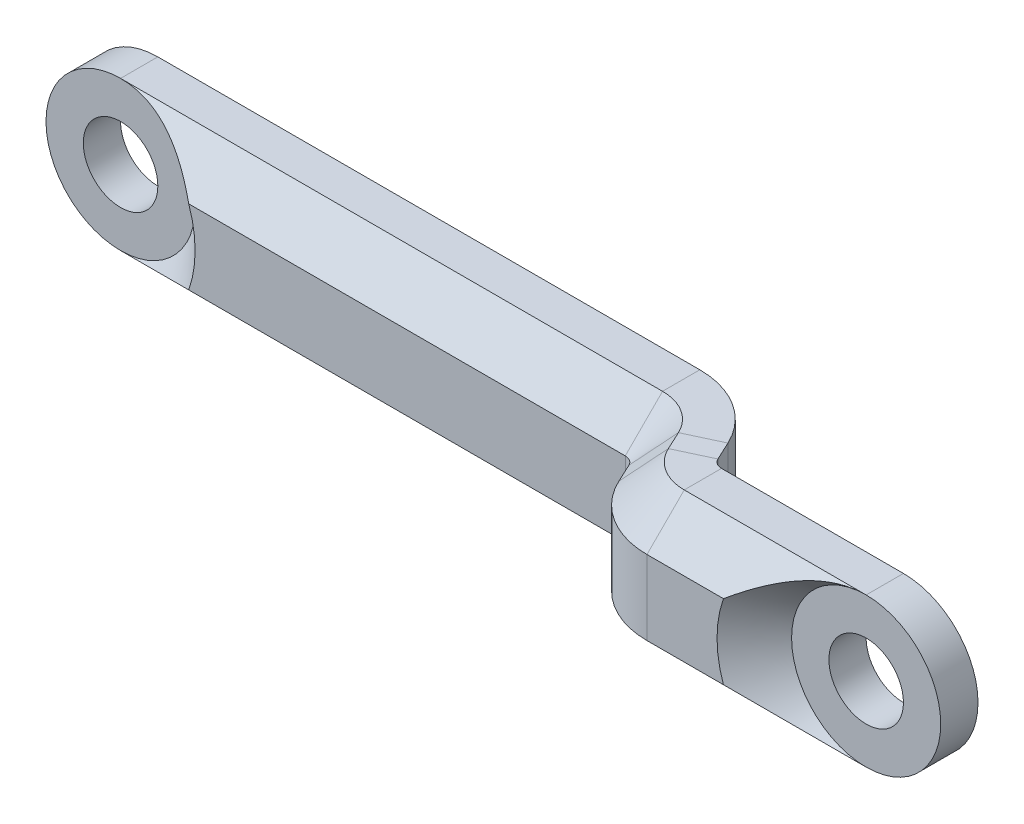
ISO-10303-21;
HEADER;
FILE_DESCRIPTION(('STEP AP214'),'2;1');
FILE_NAME('part.step','',(''),(''),'','','');
FILE_SCHEMA(('AUTOMOTIVE_DESIGN { 1 0 10303 214 1 1 1 1 }'));
ENDSEC;
DATA;
#1=APPLICATION_CONTEXT('core data for automotive mechanical design processes');
#2=APPLICATION_PROTOCOL_DEFINITION('international standard','automotive_design',2000,#1);
#3=PRODUCT_CONTEXT('',#1,'mechanical');
#4=PRODUCT('Part','Part','',(#3));
#5=PRODUCT_RELATED_PRODUCT_CATEGORY('part','',(#4));
#6=PRODUCT_DEFINITION_FORMATION('','',#4);
#7=PRODUCT_DEFINITION_CONTEXT('part definition',#1,'design');
#8=PRODUCT_DEFINITION('design','',#6,#7);
#9=PRODUCT_DEFINITION_SHAPE('','',#8);
#10=(LENGTH_UNIT() NAMED_UNIT(*) SI_UNIT(.MILLI.,.METRE.));
#11=(NAMED_UNIT(*) PLANE_ANGLE_UNIT() SI_UNIT($,.RADIAN.));
#12=(NAMED_UNIT(*) SI_UNIT($,.STERADIAN.) SOLID_ANGLE_UNIT());
#13=UNCERTAINTY_MEASURE_WITH_UNIT(LENGTH_MEASURE(1.E-05),#10,'distance_accuracy_value','');
#14=(GEOMETRIC_REPRESENTATION_CONTEXT(3) GLOBAL_UNCERTAINTY_ASSIGNED_CONTEXT((#13)) GLOBAL_UNIT_ASSIGNED_CONTEXT((#10,
#11,#12)) REPRESENTATION_CONTEXT('',''));
#15=CARTESIAN_POINT('',(0.,0.,0.));
#16=DIRECTION('',(0.,0.,1.));
#17=DIRECTION('',(1.,0.,0.));
#18=AXIS2_PLACEMENT_3D('',#15,#16,#17);
#19=CARTESIAN_POINT('',(0.,0.,-5.));
#20=DIRECTION('',(0.,0.,1.));
#21=DIRECTION('',(1.,0.,0.));
#22=AXIS2_PLACEMENT_3D('',#19,#20,#21);
#23=CYLINDRICAL_SURFACE('',#22,2.5);
#24=CARTESIAN_POINT('',(0.,0.,-5.));
#25=DIRECTION('',(0.,0.,1.));
#26=DIRECTION('',(1.,0.,0.));
#27=AXIS2_PLACEMENT_3D('',#24,#25,#26);
#28=CIRCLE('',#27,2.5);
#29=CARTESIAN_POINT('',(2.5,0.,-5.));
#30=VERTEX_POINT('',#29);
#31=EDGE_CURVE('E435',#30,#30,#28,.T.);
#32=ORIENTED_EDGE('',*,*,#31,.F.);
#33=EDGE_LOOP('',(#32));
#34=FACE_BOUND('',#33,.T.);
#35=CARTESIAN_POINT('',(0.,0.,-2.5));
#36=DIRECTION('',(0.,0.,1.));
#37=DIRECTION('',(1.,0.,0.));
#38=AXIS2_PLACEMENT_3D('',#35,#36,#37);
#39=CIRCLE('',#38,2.5);
#40=CARTESIAN_POINT('',(2.5,0.,-2.5));
#41=VERTEX_POINT('',#40);
#42=EDGE_CURVE('E196',#41,#41,#39,.F.);
#43=ORIENTED_EDGE('',*,*,#42,.F.);
#44=EDGE_LOOP('',(#43));
#45=FACE_BOUND('',#44,.T.);
#46=ADVANCED_FACE('F45',(#34,#45),#23,.F.);
#47=CARTESIAN_POINT('',(0.,0.,-5.));
#48=DIRECTION('',(0.,0.,1.));
#49=DIRECTION('',(1.,0.,0.));
#50=AXIS2_PLACEMENT_3D('',#47,#48,#49);
#51=CYLINDRICAL_SURFACE('',#50,5.);
#52=DIRECTION('',(0.,0.,1.));
#53=VECTOR('',#52,1.);
#54=CARTESIAN_POINT('',(0.,-5.,-5.));
#55=LINE('',#54,#53);
#56=CARTESIAN_POINT('',(0.,-5.,-5.));
#57=VERTEX_POINT('',#56);
#58=CARTESIAN_POINT('',(0.,-5.,-2.5));
#59=VERTEX_POINT('',#58);
#60=EDGE_CURVE('E195',#57,#59,#55,.T.);
#61=ORIENTED_EDGE('',*,*,#60,.T.);
#62=CARTESIAN_POINT('',(0.,0.,-2.5));
#63=DIRECTION('',(0.,0.,1.));
#64=DIRECTION('',(1.,0.,0.));
#65=AXIS2_PLACEMENT_3D('',#62,#63,#64);
#66=CIRCLE('',#65,5.);
#67=CARTESIAN_POINT('',(0.,5.,-2.5));
#68=VERTEX_POINT('',#67);
#69=EDGE_CURVE('E182',#68,#59,#66,.T.);
#70=ORIENTED_EDGE('',*,*,#69,.F.);
#71=DIRECTION('',(0.,0.,1.));
#72=VECTOR('',#71,1.);
#73=CARTESIAN_POINT('',(0.,5.,-5.));
#74=LINE('',#73,#72);
#75=CARTESIAN_POINT('',(0.,5.,-5.));
#76=VERTEX_POINT('',#75);
#77=EDGE_CURVE('E193',#76,#68,#74,.T.);
#78=ORIENTED_EDGE('',*,*,#77,.F.);
#79=CARTESIAN_POINT('',(0.,0.,-5.));
#80=DIRECTION('',(0.,0.,1.));
#81=DIRECTION('',(1.,0.,0.));
#82=AXIS2_PLACEMENT_3D('',#79,#80,#81);
#83=CIRCLE('',#82,5.);
#84=EDGE_CURVE('E442',#76,#57,#83,.T.);
#85=ORIENTED_EDGE('',*,*,#84,.T.);
#86=EDGE_LOOP('',(#61,#70,#78,#85));
#87=FACE_BOUND('',#86,.T.);
#88=ADVANCED_FACE('F191',(#87),#51,.T.);
#89=CARTESIAN_POINT('',(55.,0.,0.));
#90=DIRECTION('',(0.,0.,1.));
#91=DIRECTION('',(1.,0.,0.));
#92=AXIS2_PLACEMENT_3D('',#89,#90,#91);
#93=CYLINDRICAL_SURFACE('',#92,5.);
#94=DIRECTION('',(0.,0.,1.));
#95=VECTOR('',#94,1.);
#96=CARTESIAN_POINT('',(55.,5.,0.));
#97=LINE('',#96,#95);
#98=CARTESIAN_POINT('',(55.,5.,0.));
#99=VERTEX_POINT('',#98);
#100=CARTESIAN_POINT('',(55.,5.,2.50000000000002));
#101=VERTEX_POINT('',#100);
#102=EDGE_CURVE('E513',#99,#101,#97,.T.);
#103=ORIENTED_EDGE('',*,*,#102,.T.);
#104=CARTESIAN_POINT('',(55.,0.,2.50000000000002));
#105=DIRECTION('',(0.,0.,1.));
#106=DIRECTION('',(1.,0.,0.));
#107=AXIS2_PLACEMENT_3D('',#104,#105,#106);
#108=CIRCLE('',#107,5.);
#109=CARTESIAN_POINT('',(55.,-5.,2.50000000000002));
#110=VERTEX_POINT('',#109);
#111=EDGE_CURVE('E563',#110,#101,#108,.T.);
#112=ORIENTED_EDGE('',*,*,#111,.F.);
#113=DIRECTION('',(0.,0.,1.));
#114=VECTOR('',#113,1.);
#115=CARTESIAN_POINT('',(55.,-5.,0.));
#116=LINE('',#115,#114);
#117=CARTESIAN_POINT('',(55.,-5.,0.));
#118=VERTEX_POINT('',#117);
#119=EDGE_CURVE('E526',#118,#110,#116,.T.);
#120=ORIENTED_EDGE('',*,*,#119,.F.);
#121=CARTESIAN_POINT('',(55.,0.,0.));
#122=DIRECTION('',(0.,0.,1.));
#123=DIRECTION('',(1.,0.,0.));
#124=AXIS2_PLACEMENT_3D('',#121,#122,#123);
#125=CIRCLE('',#124,5.);
#126=EDGE_CURVE('E510',#118,#99,#125,.T.);
#127=ORIENTED_EDGE('',*,*,#126,.T.);
#128=EDGE_LOOP('',(#103,#112,#120,#127));
#129=FACE_BOUND('',#128,.T.);
#130=ADVANCED_FACE('F249',(#129),#93,.T.);
#131=CARTESIAN_POINT('',(55.,0.,0.));
#132=DIRECTION('',(0.,0.,1.));
#133=DIRECTION('',(1.,0.,0.));
#134=AXIS2_PLACEMENT_3D('',#131,#132,#133);
#135=CYLINDRICAL_SURFACE('',#134,2.49999999999999);
#136=CARTESIAN_POINT('',(55.,0.,0.));
#137=DIRECTION('',(0.,0.,1.));
#138=DIRECTION('',(1.,0.,0.));
#139=AXIS2_PLACEMENT_3D('',#136,#137,#138);
#140=CIRCLE('',#139,2.49999999999999);
#141=CARTESIAN_POINT('',(57.5,0.,0.));
#142=VERTEX_POINT('',#141);
#143=EDGE_CURVE('E551',#142,#142,#140,.T.);
#144=ORIENTED_EDGE('',*,*,#143,.F.);
#145=EDGE_LOOP('',(#144));
#146=FACE_BOUND('',#145,.T.);
#147=CARTESIAN_POINT('',(55.,0.,2.50000000000002));
#148=DIRECTION('',(0.,0.,1.));
#149=DIRECTION('',(1.,0.,0.));
#150=AXIS2_PLACEMENT_3D('',#147,#148,#149);
#151=CIRCLE('',#150,2.49999999999999);
#152=CARTESIAN_POINT('',(57.5,0.,2.50000000000002));
#153=VERTEX_POINT('',#152);
#154=EDGE_CURVE('E521',#153,#153,#151,.F.);
#155=ORIENTED_EDGE('',*,*,#154,.F.);
#156=EDGE_LOOP('',(#155));
#157=FACE_BOUND('',#156,.T.);
#158=ADVANCED_FACE('F280',(#146,#157),#135,.F.);
#159=CARTESIAN_POINT('',(24.6325131511786,5.,-37.9556818981374));
#160=DIRECTION('',(0.,1.,0.));
#161=DIRECTION('',(-0.906307787036651,0.,0.422618261740697));
#162=AXIS2_PLACEMENT_3D('',#159,#160,#161);
#163=PLANE('',#162);
#164=DIRECTION('',(0.906307787036651,0.,-0.422618261740697));
#165=VECTOR('',#164,1.);
#166=CARTESIAN_POINT('',(41.5445079929662,5.,-1.68779192030168));
#167=LINE('',#166,#165);
#168=CARTESIAN_POINT('',(39.2787385253746,5.,-0.631246265949928));
#169=VERTEX_POINT('',#168);
#170=CARTESIAN_POINT('',(41.5445079929662,5.,-1.68779192030168));
#171=VERTEX_POINT('',#170);
#172=EDGE_CURVE('E455',#169,#171,#167,.T.);
#173=ORIENTED_EDGE('',*,*,#172,.F.);
#174=DIRECTION('',(0.422618261740697,0.,0.906307787036651));
#175=VECTOR('',#174,1.);
#176=CARTESIAN_POINT('',(22.366743683587,5.,-36.8991362437856));
#177=LINE('',#176,#175);
#178=CARTESIAN_POINT('',(39.867448461363,5.,0.631246265949968));
#179=VERTEX_POINT('',#178);
#180=EDGE_CURVE('E368',#169,#179,#177,.T.);
#181=ORIENTED_EDGE('',*,*,#180,.T.);
#182=DIRECTION('',(0.906307787036651,0.,-0.422618261740697));
#183=VECTOR('',#182,1.);
#184=CARTESIAN_POINT('',(42.1332179289546,5.,-0.425299388401787));
#185=LINE('',#184,#183);
#186=CARTESIAN_POINT('',(42.1332179289546,5.,-0.425299388401786));
#187=VERTEX_POINT('',#186);
#188=EDGE_CURVE('E460',#179,#187,#185,.T.);
#189=ORIENTED_EDGE('',*,*,#188,.T.);
#190=DIRECTION('',(-0.422618261740697,0.,-0.906307787036651));
#191=VECTOR('',#190,1.);
#192=CARTESIAN_POINT('',(24.6325131511786,5.,-37.9556818981374));
#193=LINE('',#192,#191);
#194=EDGE_CURVE('E451',#187,#171,#193,.T.);
#195=ORIENTED_EDGE('',*,*,#194,.T.);
#196=EDGE_LOOP('',(#173,#181,#189,#195));
#197=FACE_BOUND('',#196,.T.);
#198=ADVANCED_FACE('F276',(#197),#163,.T.);
#199=CARTESIAN_POINT('',(24.6325131511786,-5.,-37.9556818981374));
#200=DIRECTION('',(0.,-1.,0.));
#201=DIRECTION('',(0.906307787036651,0.,-0.422618261740697));
#202=AXIS2_PLACEMENT_3D('',#199,#200,#201);
#203=PLANE('',#202);
#204=DIRECTION('',(-0.906307787036651,0.,0.422618261740697));
#205=VECTOR('',#204,1.);
#206=CARTESIAN_POINT('',(42.1332179289546,-5.,-0.425299388401787));
#207=LINE('',#206,#205);
#208=CARTESIAN_POINT('',(42.1332179289546,-5.,-0.425299388401786));
#209=VERTEX_POINT('',#208);
#210=CARTESIAN_POINT('',(39.867448461363,-5.,0.631246265949968));
#211=VERTEX_POINT('',#210);
#212=EDGE_CURVE('E465',#209,#211,#207,.T.);
#213=ORIENTED_EDGE('',*,*,#212,.T.);
#214=DIRECTION('',(-0.422618261740697,0.,-0.906307787036651));
#215=VECTOR('',#214,1.);
#216=CARTESIAN_POINT('',(22.366743683587,-5.,-36.8991362437856));
#217=LINE('',#216,#215);
#218=CARTESIAN_POINT('',(39.2787385253746,-5.,-0.631246265949931));
#219=VERTEX_POINT('',#218);
#220=EDGE_CURVE('E395',#211,#219,#217,.T.);
#221=ORIENTED_EDGE('',*,*,#220,.T.);
#222=DIRECTION('',(-0.906307787036651,0.,0.422618261740697));
#223=VECTOR('',#222,1.);
#224=CARTESIAN_POINT('',(41.5445079929662,-5.,-1.68779192030168));
#225=LINE('',#224,#223);
#226=CARTESIAN_POINT('',(41.5445079929662,-4.99999999999999,-1.68779192030168));
#227=VERTEX_POINT('',#226);
#228=EDGE_CURVE('E430',#227,#219,#225,.T.);
#229=ORIENTED_EDGE('',*,*,#228,.F.);
#230=DIRECTION('',(0.422618261740697,0.,0.906307787036651));
#231=VECTOR('',#230,1.);
#232=CARTESIAN_POINT('',(24.6325131511786,-5.,-37.9556818981374));
#233=LINE('',#232,#231);
#234=EDGE_CURVE('E203',#227,#209,#233,.T.);
#235=ORIENTED_EDGE('',*,*,#234,.T.);
#236=EDGE_LOOP('',(#213,#221,#229,#235));
#237=FACE_BOUND('',#236,.T.);
#238=ADVANCED_FACE('F279',(#237),#203,.T.);
#239=CARTESIAN_POINT('',(20.1009742159954,0.,-35.8425905894339));
#240=DIRECTION('',(-0.906307787036651,0.,0.422618261740697));
#241=DIRECTION('',(0.422618261740697,0.,0.906307787036651));
#242=AXIS2_PLACEMENT_3D('',#239,#240,#241);
#243=PLANE('',#242);
#244=DIRECTION('',(0.,1.,0.));
#245=VECTOR('',#244,1.);
#246=CARTESIAN_POINT('',(37.6016789937714,0.,1.6877919203017));
#247=LINE('',#246,#245);
#248=CARTESIAN_POINT('',(37.6016789937714,-2.50000000000002,1.6877919203017));
#249=VERTEX_POINT('',#248);
#250=CARTESIAN_POINT('',(37.6016789937714,2.50000000000001,1.6877919203017));
#251=VERTEX_POINT('',#250);
#252=EDGE_CURVE('E462',#249,#251,#247,.T.);
#253=ORIENTED_EDGE('',*,*,#252,.T.);
#254=DIRECTION('',(-0.422618261740697,0.,-0.906307787036651));
#255=VECTOR('',#254,1.);
#256=CARTESIAN_POINT('',(20.1009742159954,2.50000000000001,-35.8425905894339));
#257=LINE('',#256,#255);
#258=CARTESIAN_POINT('',(37.012969057783,2.50000000000002,0.425299388401801));
#259=VERTEX_POINT('',#258);
#260=EDGE_CURVE('E366',#251,#259,#257,.T.);
#261=ORIENTED_EDGE('',*,*,#260,.T.);
#262=DIRECTION('',(0.,1.,0.));
#263=VECTOR('',#262,1.);
#264=CARTESIAN_POINT('',(37.012969057783,0.,0.425299388401801));
#265=LINE('',#264,#263);
#266=CARTESIAN_POINT('',(37.012969057783,-2.50000000000001,0.425299388401801));
#267=VERTEX_POINT('',#266);
#268=EDGE_CURVE('E453',#267,#259,#265,.T.);
#269=ORIENTED_EDGE('',*,*,#268,.F.);
#270=DIRECTION('',(0.422618261740697,0.,0.906307787036651));
#271=VECTOR('',#270,1.);
#272=CARTESIAN_POINT('',(20.1009742159954,-2.50000000000002,-35.8425905894339));
#273=LINE('',#272,#271);
#274=EDGE_CURVE('E394',#267,#249,#273,.T.);
#275=ORIENTED_EDGE('',*,*,#274,.T.);
#276=EDGE_LOOP('',(#253,#261,#269,#275));
#277=FACE_BOUND('',#276,.T.);
#278=ADVANCED_FACE('F274',(#277),#243,.T.);
#279=CARTESIAN_POINT('',(24.6325131511786,0.,-37.9556818981374));
#280=DIRECTION('',(-0.906307787036651,0.,0.422618261740697));
#281=DIRECTION('',(0.422618261740697,0.,0.906307787036651));
#282=AXIS2_PLACEMENT_3D('',#279,#280,#281);
#283=PLANE('',#282);
#284=DIRECTION('',(0.,1.,0.));
#285=VECTOR('',#284,1.);
#286=CARTESIAN_POINT('',(42.1332179289546,0.,-0.425299388401787));
#287=LINE('',#286,#285);
#288=EDGE_CURVE('E457',#209,#187,#287,.T.);
#289=ORIENTED_EDGE('',*,*,#288,.F.);
#290=ORIENTED_EDGE('',*,*,#234,.F.);
#291=DIRECTION('',(0.,1.,0.));
#292=VECTOR('',#291,1.);
#293=CARTESIAN_POINT('',(41.5445079929662,0.,-1.68779192030168));
#294=LINE('',#293,#292);
#295=EDGE_CURVE('E448',#227,#171,#294,.T.);
#296=ORIENTED_EDGE('',*,*,#295,.T.);
#297=ORIENTED_EDGE('',*,*,#194,.F.);
#298=EDGE_LOOP('',(#289,#290,#296,#297));
#299=FACE_BOUND('',#298,.T.);
#300=ADVANCED_FACE('F261',(#299),#283,.F.);
#301=CARTESIAN_POINT('',(0.,0.,-5.));
#302=DIRECTION('',(0.,0.,1.));
#303=DIRECTION('',(1.,0.,0.));
#304=AXIS2_PLACEMENT_3D('',#301,#302,#303);
#305=PLANE('',#304);
#306=DIRECTION('',(0.,1.,0.));
#307=VECTOR('',#306,1.);
#308=CARTESIAN_POINT('',(36.3453827418518,0.,-5.));
#309=LINE('',#308,#307);
#310=CARTESIAN_POINT('',(36.3453827418518,-4.99999999999999,-5.));
#311=VERTEX_POINT('',#310);
#312=CARTESIAN_POINT('',(36.3453827418518,5.,-5.));
#313=VERTEX_POINT('',#312);
#314=EDGE_CURVE('E444',#311,#313,#309,.T.);
#315=ORIENTED_EDGE('',*,*,#314,.F.);
#316=DIRECTION('',(1.,0.,0.));
#317=VECTOR('',#316,1.);
#318=CARTESIAN_POINT('',(0.,-5.,-5.));
#319=LINE('',#318,#317);
#320=EDGE_CURVE('E433',#57,#311,#319,.T.);
#321=ORIENTED_EDGE('',*,*,#320,.F.);
#322=ORIENTED_EDGE('',*,*,#84,.F.);
#323=DIRECTION('',(-1.,0.,0.));
#324=VECTOR('',#323,1.);
#325=CARTESIAN_POINT('',(0.,5.,-5.));
#326=LINE('',#325,#324);
#327=EDGE_CURVE('E202',#313,#76,#326,.T.);
#328=ORIENTED_EDGE('',*,*,#327,.F.);
#329=EDGE_LOOP('',(#315,#321,#322,#328));
#330=FACE_BOUND('',#329,.T.);
#331=ORIENTED_EDGE('',*,*,#31,.T.);
#332=EDGE_LOOP('',(#331));
#333=FACE_BOUND('',#332,.T.);
#334=ADVANCED_FACE('F257',(#330,#333),#305,.F.);
#335=CARTESIAN_POINT('',(0.,-5.,-5.));
#336=DIRECTION('',(0.,-1.,0.));
#337=DIRECTION('',(0.,0.,-1.));
#338=AXIS2_PLACEMENT_3D('',#335,#336,#337);
#339=PLANE('',#338);
#340=DIRECTION('',(0.,0.,1.));
#341=VECTOR('',#340,1.);
#342=CARTESIAN_POINT('',(36.3453827418518,-5.,-5.));
#343=LINE('',#342,#341);
#344=CARTESIAN_POINT('',(36.3453827418518,-5.,-2.49999999999998));
#345=VERTEX_POINT('',#344);
#346=EDGE_CURVE('E423',#311,#345,#343,.T.);
#347=ORIENTED_EDGE('',*,*,#346,.T.);
#348=DIRECTION('',(-1.,0.,0.));
#349=VECTOR('',#348,1.);
#350=CARTESIAN_POINT('',(0.,-5.,-2.49999999999998));
#351=LINE('',#350,#349);
#352=EDGE_CURVE('E12',#345,#59,#351,.T.);
#353=ORIENTED_EDGE('',*,*,#352,.T.);
#354=ORIENTED_EDGE('',*,*,#60,.F.);
#355=ORIENTED_EDGE('',*,*,#320,.T.);
#356=EDGE_LOOP('',(#347,#353,#354,#355));
#357=FACE_BOUND('',#356,.T.);
#358=ADVANCED_FACE('F260',(#357),#339,.T.);
#359=CARTESIAN_POINT('',(0.,0.,0.));
#360=DIRECTION('',(0.,0.,1.));
#361=DIRECTION('',(1.,0.,0.));
#362=AXIS2_PLACEMENT_3D('',#359,#360,#361);
#363=PLANE('',#362);
#364=DIRECTION('',(0.,1.,0.));
#365=VECTOR('',#364,1.);
#366=CARTESIAN_POINT('',(36.3453827418518,0.,0.));
#367=LINE('',#366,#365);
#368=CARTESIAN_POINT('',(36.3453827418518,-2.50000000000001,0.));
#369=VERTEX_POINT('',#368);
#370=CARTESIAN_POINT('',(36.3453827418518,2.50000000000001,0.));
#371=VERTEX_POINT('',#370);
#372=EDGE_CURVE('E417',#369,#371,#367,.T.);
#373=ORIENTED_EDGE('',*,*,#372,.T.);
#374=DIRECTION('',(-1.,0.,0.));
#375=VECTOR('',#374,1.);
#376=CARTESIAN_POINT('',(0.,2.50000000000001,0.));
#377=LINE('',#376,#375);
#378=CARTESIAN_POINT('',(7.07106781186545,2.50000000000001,0.));
#379=VERTEX_POINT('',#378);
#380=EDGE_CURVE('E74',#371,#379,#377,.T.);
#381=ORIENTED_EDGE('',*,*,#380,.T.);
#382=CARTESIAN_POINT('',(0.,0.,0.));
#383=DIRECTION('',(0.,0.,1.));
#384=DIRECTION('',(1.,0.,0.));
#385=AXIS2_PLACEMENT_3D('',#382,#383,#384);
#386=CIRCLE('',#385,7.49999999999998);
#387=CARTESIAN_POINT('',(7.07106781186545,-2.50000000000001,0.));
#388=VERTEX_POINT('',#387);
#389=EDGE_CURVE('E69',#379,#388,#386,.F.);
#390=ORIENTED_EDGE('',*,*,#389,.T.);
#391=DIRECTION('',(1.,0.,0.));
#392=VECTOR('',#391,1.);
#393=CARTESIAN_POINT('',(0.,-2.50000000000001,0.));
#394=LINE('',#393,#392);
#395=EDGE_CURVE('E413',#388,#369,#394,.T.);
#396=ORIENTED_EDGE('',*,*,#395,.T.);
#397=EDGE_LOOP('',(#373,#381,#390,#396));
#398=FACE_BOUND('',#397,.T.);
#399=ADVANCED_FACE('F265',(#398),#363,.T.);
#400=CARTESIAN_POINT('',(0.,5.,-5.));
#401=DIRECTION('',(0.,1.,0.));
#402=DIRECTION('',(0.,0.,1.));
#403=AXIS2_PLACEMENT_3D('',#400,#401,#402);
#404=PLANE('',#403);
#405=ORIENTED_EDGE('',*,*,#77,.T.);
#406=DIRECTION('',(1.,0.,0.));
#407=VECTOR('',#406,1.);
#408=CARTESIAN_POINT('',(0.,5.,-2.49999999999998));
#409=LINE('',#408,#407);
#410=CARTESIAN_POINT('',(36.3453827418518,5.,-2.49999999999998));
#411=VERTEX_POINT('',#410);
#412=EDGE_CURVE('E61',#68,#411,#409,.T.);
#413=ORIENTED_EDGE('',*,*,#412,.T.);
#414=DIRECTION('',(0.,0.,-1.));
#415=VECTOR('',#414,1.);
#416=CARTESIAN_POINT('',(36.3453827418518,5.,-5.));
#417=LINE('',#416,#415);
#418=EDGE_CURVE('E422',#411,#313,#417,.T.);
#419=ORIENTED_EDGE('',*,*,#418,.T.);
#420=ORIENTED_EDGE('',*,*,#327,.T.);
#421=EDGE_LOOP('',(#405,#413,#419,#420));
#422=FACE_BOUND('',#421,.T.);
#423=ADVANCED_FACE('F199',(#422),#404,.T.);
#424=CARTESIAN_POINT('',(36.3453827418518,-4.99999999999999,0.7366));
#425=DIRECTION('',(0.,-1.,0.));
#426=DIRECTION('',(0.,0.,-1.));
#427=AXIS2_PLACEMENT_3D('',#424,#425,#426);
#428=PLANE('',#427);
#429=ORIENTED_EDGE('',*,*,#228,.T.);
#430=CARTESIAN_POINT('',(36.3453827418518,-4.99999999999999,0.7366));
#431=DIRECTION('',(0.,-1.,0.));
#432=DIRECTION('',(0.,0.,-1.));
#433=AXIS2_PLACEMENT_3D('',#430,#431,#432);
#434=CIRCLE('',#433,3.23659999999998);
#435=EDGE_CURVE('E410',#219,#345,#434,.F.);
#436=ORIENTED_EDGE('',*,*,#435,.T.);
#437=ORIENTED_EDGE('',*,*,#346,.F.);
#438=CARTESIAN_POINT('',(36.3453827418518,-4.99999999999999,0.7366));
#439=DIRECTION('',(0.,1.,0.));
#440=DIRECTION('',(0.,0.,-1.));
#441=AXIS2_PLACEMENT_3D('',#438,#439,#440);
#442=CIRCLE('',#441,5.7366);
#443=EDGE_CURVE('E528',#227,#311,#442,.T.);
#444=ORIENTED_EDGE('',*,*,#443,.F.);
#445=EDGE_LOOP('',(#429,#436,#437,#444));
#446=FACE_BOUND('',#445,.T.);
#447=ADVANCED_FACE('F271',(#446),#428,.T.);
#448=CARTESIAN_POINT('',(36.3453827418518,5.,0.7366));
#449=DIRECTION('',(0.,1.,0.));
#450=DIRECTION('',(0.,0.,1.));
#451=AXIS2_PLACEMENT_3D('',#448,#449,#450);
#452=PLANE('',#451);
#453=ORIENTED_EDGE('',*,*,#418,.F.);
#454=CARTESIAN_POINT('',(36.3453827418518,5.,0.7366));
#455=DIRECTION('',(0.,1.,0.));
#456=DIRECTION('',(0.,0.,1.));
#457=AXIS2_PLACEMENT_3D('',#454,#455,#456);
#458=CIRCLE('',#457,3.23659999999997);
#459=EDGE_CURVE('E400',#411,#169,#458,.F.);
#460=ORIENTED_EDGE('',*,*,#459,.T.);
#461=ORIENTED_EDGE('',*,*,#172,.T.);
#462=CARTESIAN_POINT('',(36.3453827418518,5.,0.7366));
#463=DIRECTION('',(0.,-1.,0.));
#464=DIRECTION('',(0.,0.,1.));
#465=AXIS2_PLACEMENT_3D('',#462,#463,#464);
#466=CIRCLE('',#465,5.7366);
#467=EDGE_CURVE('E447',#313,#171,#466,.T.);
#468=ORIENTED_EDGE('',*,*,#467,.F.);
#469=EDGE_LOOP('',(#453,#460,#461,#468));
#470=FACE_BOUND('',#469,.T.);
#471=ADVANCED_FACE('F254',(#470),#452,.T.);
#472=CARTESIAN_POINT('',(36.3453827418518,11.7678443637323,0.7366));
#473=DIRECTION('',(0.,-1.,0.));
#474=DIRECTION('',(0.,0.,-1.));
#475=AXIS2_PLACEMENT_3D('',#472,#473,#474);
#476=CYLINDRICAL_SURFACE('',#475,5.7366);
#477=ORIENTED_EDGE('',*,*,#314,.T.);
#478=ORIENTED_EDGE('',*,*,#467,.T.);
#479=ORIENTED_EDGE('',*,*,#295,.F.);
#480=ORIENTED_EDGE('',*,*,#443,.T.);
#481=EDGE_LOOP('',(#477,#478,#479,#480));
#482=FACE_BOUND('',#481,.T.);
#483=ADVANCED_FACE('F536',(#482),#476,.T.);
#484=CARTESIAN_POINT('',(36.3453827418518,11.7678443637323,0.7366));
#485=DIRECTION('',(0.,-1.,0.));
#486=DIRECTION('',(0.,0.,-1.));
#487=AXIS2_PLACEMENT_3D('',#484,#485,#486);
#488=CYLINDRICAL_SURFACE('',#487,0.7366);
#489=ORIENTED_EDGE('',*,*,#268,.T.);
#490=CARTESIAN_POINT('',(36.3453827418518,2.50000000000002,0.7366));
#491=DIRECTION('',(0.,1.,0.));
#492=DIRECTION('',(0.,0.,1.));
#493=AXIS2_PLACEMENT_3D('',#490,#491,#492);
#494=CIRCLE('',#493,0.7366);
#495=EDGE_CURVE('E408',#259,#371,#494,.T.);
#496=ORIENTED_EDGE('',*,*,#495,.T.);
#497=ORIENTED_EDGE('',*,*,#372,.F.);
#498=CARTESIAN_POINT('',(36.3453827418518,-2.50000000000001,0.7366));
#499=DIRECTION('',(0.,-1.,0.));
#500=DIRECTION('',(0.,0.,-1.));
#501=AXIS2_PLACEMENT_3D('',#498,#499,#500);
#502=CIRCLE('',#501,0.7366);
#503=EDGE_CURVE('E402',#369,#267,#502,.T.);
#504=ORIENTED_EDGE('',*,*,#503,.T.);
#505=EDGE_LOOP('',(#489,#496,#497,#504));
#506=FACE_BOUND('',#505,.T.);
#507=ADVANCED_FACE('F420',(#506),#488,.F.);
#508=CARTESIAN_POINT('',(42.8008042448858,-5.,-0.736599999999984));
#509=DIRECTION('',(0.,1.,0.));
#510=DIRECTION('',(0.,0.,1.));
#511=AXIS2_PLACEMENT_3D('',#508,#509,#510);
#512=PLANE('',#511);
#513=DIRECTION('',(0.,0.,1.));
#514=VECTOR('',#513,1.);
#515=CARTESIAN_POINT('',(42.8008042448858,-5.,0.));
#516=LINE('',#515,#514);
#517=CARTESIAN_POINT('',(42.8008042448858,-5.,0.));
#518=VERTEX_POINT('',#517);
#519=CARTESIAN_POINT('',(42.8008042448858,-5.,2.50000000000004));
#520=VERTEX_POINT('',#519);
#521=EDGE_CURVE('E515',#518,#520,#516,.T.);
#522=ORIENTED_EDGE('',*,*,#521,.T.);
#523=CARTESIAN_POINT('',(42.8008042448858,-5.,-0.736599999999984));
#524=DIRECTION('',(0.,1.,0.));
#525=DIRECTION('',(0.,0.,1.));
#526=AXIS2_PLACEMENT_3D('',#523,#524,#525);
#527=CIRCLE('',#526,3.23660000000003);
#528=EDGE_CURVE('E389',#520,#211,#527,.F.);
#529=ORIENTED_EDGE('',*,*,#528,.T.);
#530=ORIENTED_EDGE('',*,*,#212,.F.);
#531=CARTESIAN_POINT('',(42.8008042448858,-5.,-0.736599999999984));
#532=DIRECTION('',(0.,-1.,0.));
#533=DIRECTION('',(0.,0.,1.));
#534=AXIS2_PLACEMENT_3D('',#531,#532,#533);
#535=CIRCLE('',#534,0.736599999999999);
#536=EDGE_CURVE('E522',#518,#209,#535,.T.);
#537=ORIENTED_EDGE('',*,*,#536,.F.);
#538=EDGE_LOOP('',(#522,#529,#530,#537));
#539=FACE_BOUND('',#538,.T.);
#540=ADVANCED_FACE('F544',(#539),#512,.F.);
#541=CARTESIAN_POINT('',(42.8008042448858,5.,-0.736599999999984));
#542=DIRECTION('',(0.,-1.,0.));
#543=DIRECTION('',(0.,0.,-1.));
#544=AXIS2_PLACEMENT_3D('',#541,#542,#543);
#545=PLANE('',#544);
#546=ORIENTED_EDGE('',*,*,#188,.F.);
#547=CARTESIAN_POINT('',(42.8008042448858,5.,-0.736599999999984));
#548=DIRECTION('',(0.,-1.,0.));
#549=DIRECTION('',(0.,0.,-1.));
#550=AXIS2_PLACEMENT_3D('',#547,#548,#549);
#551=CIRCLE('',#550,3.23660000000003);
#552=CARTESIAN_POINT('',(42.8008042448858,5.,2.50000000000004));
#553=VERTEX_POINT('',#552);
#554=EDGE_CURVE('E482',#179,#553,#551,.F.);
#555=ORIENTED_EDGE('',*,*,#554,.T.);
#556=DIRECTION('',(0.,0.,-1.));
#557=VECTOR('',#556,1.);
#558=CARTESIAN_POINT('',(42.8008042448858,5.,0.));
#559=LINE('',#558,#557);
#560=CARTESIAN_POINT('',(42.8008042448858,5.,0.));
#561=VERTEX_POINT('',#560);
#562=EDGE_CURVE('E501',#553,#561,#559,.T.);
#563=ORIENTED_EDGE('',*,*,#562,.T.);
#564=CARTESIAN_POINT('',(42.8008042448858,5.,-0.736599999999984));
#565=DIRECTION('',(0.,1.,0.));
#566=DIRECTION('',(0.,0.,-1.));
#567=AXIS2_PLACEMENT_3D('',#564,#565,#566);
#568=CIRCLE('',#567,0.736599999999999);
#569=EDGE_CURVE('E525',#187,#561,#568,.T.);
#570=ORIENTED_EDGE('',*,*,#569,.F.);
#571=EDGE_LOOP('',(#546,#555,#563,#570));
#572=FACE_BOUND('',#571,.T.);
#573=ADVANCED_FACE('F499',(#572),#545,.F.);
#574=CARTESIAN_POINT('',(42.8008042448858,12.9077429682134,-0.736599999999984));
#575=DIRECTION('',(0.,-1.,0.));
#576=DIRECTION('',(0.,0.,-1.));
#577=AXIS2_PLACEMENT_3D('',#574,#575,#576);
#578=CYLINDRICAL_SURFACE('',#577,0.7366);
#579=ORIENTED_EDGE('',*,*,#288,.T.);
#580=ORIENTED_EDGE('',*,*,#569,.T.);
#581=DIRECTION('',(0.,1.,0.));
#582=VECTOR('',#581,1.);
#583=CARTESIAN_POINT('',(42.8008042448858,0.,0.));
#584=LINE('',#583,#582);
#585=EDGE_CURVE('E548',#518,#561,#584,.T.);
#586=ORIENTED_EDGE('',*,*,#585,.F.);
#587=ORIENTED_EDGE('',*,*,#536,.T.);
#588=EDGE_LOOP('',(#579,#580,#586,#587));
#589=FACE_BOUND('',#588,.T.);
#590=ADVANCED_FACE('F547',(#589),#578,.F.);
#591=CARTESIAN_POINT('',(42.8008042448858,12.9077429682134,-0.736599999999984));
#592=DIRECTION('',(0.,-1.,0.));
#593=DIRECTION('',(0.,0.,-1.));
#594=AXIS2_PLACEMENT_3D('',#591,#592,#593);
#595=CYLINDRICAL_SURFACE('',#594,5.7366);
#596=DIRECTION('',(0.,1.,0.));
#597=VECTOR('',#596,1.);
#598=CARTESIAN_POINT('',(42.8008042448858,0.,5.00000000000002));
#599=LINE('',#598,#597);
#600=CARTESIAN_POINT('',(42.8008042448858,-2.50000000000002,5.00000000000002));
#601=VERTEX_POINT('',#600);
#602=CARTESIAN_POINT('',(42.8008042448858,2.50000000000002,5.00000000000002));
#603=VERTEX_POINT('',#602);
#604=EDGE_CURVE('E494',#601,#603,#599,.T.);
#605=ORIENTED_EDGE('',*,*,#604,.T.);
#606=CARTESIAN_POINT('',(42.8008042448858,2.50000000000002,-0.736599999999984));
#607=DIRECTION('',(0.,1.,0.));
#608=DIRECTION('',(0.,0.,1.));
#609=AXIS2_PLACEMENT_3D('',#606,#607,#608);
#610=CIRCLE('',#609,5.7366);
#611=EDGE_CURVE('E485',#603,#251,#610,.F.);
#612=ORIENTED_EDGE('',*,*,#611,.T.);
#613=ORIENTED_EDGE('',*,*,#252,.F.);
#614=CARTESIAN_POINT('',(42.8008042448858,-2.50000000000002,-0.736599999999984));
#615=DIRECTION('',(0.,-1.,0.));
#616=DIRECTION('',(0.,0.,-1.));
#617=AXIS2_PLACEMENT_3D('',#614,#615,#616);
#618=CIRCLE('',#617,5.7366);
#619=EDGE_CURVE('E391',#249,#601,#618,.F.);
#620=ORIENTED_EDGE('',*,*,#619,.T.);
#621=EDGE_LOOP('',(#605,#612,#613,#620));
#622=FACE_BOUND('',#621,.T.);
#623=ADVANCED_FACE('F491',(#622),#595,.T.);
#624=CARTESIAN_POINT('',(-2.28119733362565,0.,0.));
#625=DIRECTION('',(0.,0.,1.));
#626=DIRECTION('',(1.,0.,0.));
#627=AXIS2_PLACEMENT_3D('',#624,#625,#626);
#628=PLANE('',#627);
#629=ORIENTED_EDGE('',*,*,#143,.T.);
#630=EDGE_LOOP('',(#629));
#631=FACE_BOUND('',#630,.T.);
#632=DIRECTION('',(1.,0.,0.));
#633=VECTOR('',#632,1.);
#634=CARTESIAN_POINT('',(-2.28119733362565,-5.,0.));
#635=LINE('',#634,#633);
#636=EDGE_CURVE('E553',#518,#118,#635,.T.);
#637=ORIENTED_EDGE('',*,*,#636,.F.);
#638=ORIENTED_EDGE('',*,*,#585,.T.);
#639=DIRECTION('',(-1.,0.,0.));
#640=VECTOR('',#639,1.);
#641=CARTESIAN_POINT('',(-2.28119733362565,5.,0.));
#642=LINE('',#641,#640);
#643=EDGE_CURVE('E508',#99,#561,#642,.T.);
#644=ORIENTED_EDGE('',*,*,#643,.F.);
#645=ORIENTED_EDGE('',*,*,#126,.F.);
#646=EDGE_LOOP('',(#637,#638,#644,#645));
#647=FACE_BOUND('',#646,.T.);
#648=ADVANCED_FACE('F579',(#631,#647),#628,.F.);
#649=CARTESIAN_POINT('',(-2.28119733362565,5.,0.));
#650=DIRECTION('',(0.,1.,0.));
#651=DIRECTION('',(0.,0.,1.));
#652=AXIS2_PLACEMENT_3D('',#649,#650,#651);
#653=PLANE('',#652);
#654=ORIENTED_EDGE('',*,*,#562,.F.);
#655=DIRECTION('',(1.,0.,0.));
#656=VECTOR('',#655,1.);
#657=CARTESIAN_POINT('',(-2.28119733362565,5.,2.50000000000004));
#658=LINE('',#657,#656);
#659=EDGE_CURVE('E480',#553,#101,#658,.T.);
#660=ORIENTED_EDGE('',*,*,#659,.T.);
#661=ORIENTED_EDGE('',*,*,#102,.F.);
#662=ORIENTED_EDGE('',*,*,#643,.T.);
#663=EDGE_LOOP('',(#654,#660,#661,#662));
#664=FACE_BOUND('',#663,.T.);
#665=ADVANCED_FACE('F505',(#664),#653,.T.);
#666=CARTESIAN_POINT('',(-2.28119733362565,0.,5.00000000000002));
#667=DIRECTION('',(0.,0.,1.));
#668=DIRECTION('',(1.,0.,0.));
#669=AXIS2_PLACEMENT_3D('',#666,#667,#668);
#670=PLANE('',#669);
#671=ORIENTED_EDGE('',*,*,#604,.F.);
#672=DIRECTION('',(1.,0.,0.));
#673=VECTOR('',#672,1.);
#674=CARTESIAN_POINT('',(-2.28119733362565,-2.50000000000001,5.00000000000002));
#675=LINE('',#674,#673);
#676=CARTESIAN_POINT('',(47.9289321881346,-2.50000000000001,5.00000000000002));
#677=VERTEX_POINT('',#676);
#678=EDGE_CURVE('E475',#601,#677,#675,.T.);
#679=ORIENTED_EDGE('',*,*,#678,.T.);
#680=CARTESIAN_POINT('',(55.,0.,5.00000000000002));
#681=DIRECTION('',(0.,0.,1.));
#682=DIRECTION('',(1.,0.,0.));
#683=AXIS2_PLACEMENT_3D('',#680,#681,#682);
#684=CIRCLE('',#683,7.49999999999999);
#685=CARTESIAN_POINT('',(47.9289321881346,2.50000000000001,5.00000000000002));
#686=VERTEX_POINT('',#685);
#687=EDGE_CURVE('E467',#677,#686,#684,.F.);
#688=ORIENTED_EDGE('',*,*,#687,.T.);
#689=DIRECTION('',(-1.,0.,0.));
#690=VECTOR('',#689,1.);
#691=CARTESIAN_POINT('',(-2.28119733362565,2.50000000000001,5.00000000000002));
#692=LINE('',#691,#690);
#693=EDGE_CURVE('E473',#686,#603,#692,.T.);
#694=ORIENTED_EDGE('',*,*,#693,.T.);
#695=EDGE_LOOP('',(#671,#679,#688,#694));
#696=FACE_BOUND('',#695,.T.);
#697=ADVANCED_FACE('F587',(#696),#670,.T.);
#698=CARTESIAN_POINT('',(-2.28119733362565,-5.,0.));
#699=DIRECTION('',(0.,-1.,0.));
#700=DIRECTION('',(0.,0.,-1.));
#701=AXIS2_PLACEMENT_3D('',#698,#699,#700);
#702=PLANE('',#701);
#703=ORIENTED_EDGE('',*,*,#119,.T.);
#704=DIRECTION('',(-1.,0.,0.));
#705=VECTOR('',#704,1.);
#706=CARTESIAN_POINT('',(-2.28119733362565,-5.,2.50000000000004));
#707=LINE('',#706,#705);
#708=EDGE_CURVE('E478',#110,#520,#707,.T.);
#709=ORIENTED_EDGE('',*,*,#708,.T.);
#710=ORIENTED_EDGE('',*,*,#521,.F.);
#711=ORIENTED_EDGE('',*,*,#636,.T.);
#712=EDGE_LOOP('',(#703,#709,#710,#711));
#713=FACE_BOUND('',#712,.T.);
#714=ADVANCED_FACE('F577',(#713),#702,.T.);
#715=CARTESIAN_POINT('',(55.,0.,2.50000000000002));
#716=DIRECTION('',(0.,0.,1.));
#717=DIRECTION('',(1.,0.,0.));
#718=AXIS2_PLACEMENT_3D('',#715,#716,#717);
#719=PLANE('',#718);
#720=EDGE_CURVE('E569',#101,#110,#108,.T.);
#721=ORIENTED_EDGE('',*,*,#720,.T.);
#722=ORIENTED_EDGE('',*,*,#111,.T.);
#723=EDGE_LOOP('',(#721,#722));
#724=FACE_BOUND('',#723,.T.);
#725=ORIENTED_EDGE('',*,*,#154,.T.);
#726=EDGE_LOOP('',(#725));
#727=FACE_BOUND('',#726,.T.);
#728=ADVANCED_FACE('F598',(#724,#727),#719,.T.);
#729=CARTESIAN_POINT('',(0.,0.,-2.5));
#730=DIRECTION('',(0.,0.,1.));
#731=DIRECTION('',(1.,0.,0.));
#732=AXIS2_PLACEMENT_3D('',#729,#730,#731);
#733=PLANE('',#732);
#734=ORIENTED_EDGE('',*,*,#69,.T.);
#735=EDGE_CURVE('E178',#59,#68,#66,.T.);
#736=ORIENTED_EDGE('',*,*,#735,.T.);
#737=EDGE_LOOP('',(#734,#736));
#738=FACE_BOUND('',#737,.T.);
#739=ORIENTED_EDGE('',*,*,#42,.T.);
#740=EDGE_LOOP('',(#739));
#741=FACE_BOUND('',#740,.T.);
#742=ADVANCED_FACE('F180',(#738,#741),#733,.T.);
#743=CARTESIAN_POINT('',(0.,2.50000000000001,0.));
#744=DIRECTION('',(0.,-0.707106781186546,-0.707106781186549));
#745=DIRECTION('',(-1.,0.,0.));
#746=AXIS2_PLACEMENT_3D('',#743,#744,#745);
#747=PLANE('',#746);
#748=DIRECTION('',(0.,-0.707106781186549,0.707106781186546));
#749=VECTOR('',#748,1.);
#750=CARTESIAN_POINT('',(36.3453827418518,5.,-2.49999999999998));
#751=LINE('',#750,#749);
#752=EDGE_CURVE('E208',#411,#371,#751,.T.);
#753=ORIENTED_EDGE('',*,*,#752,.F.);
#754=ORIENTED_EDGE('',*,*,#412,.F.);
#755=CARTESIAN_POINT('',(7.07106781186545,2.50000000000001,0.));
#756=CARTESIAN_POINT('',(6.94145596445915,2.59164145551575,-0.0916414555157336));
#757=CARTESIAN_POINT('',(6.81006387854419,2.68203746726658,-0.182037467266569));
#758=CARTESIAN_POINT('',(6.54348107634261,2.86003346179967,-0.360033461799653));
#759=CARTESIAN_POINT('',(6.40828934339722,2.94763268260095,-0.447632682600937));
#760=CARTESIAN_POINT('',(6.13335691794881,3.12004505203107,-0.620045052031054));
#761=CARTESIAN_POINT('',(5.99359935918418,3.20484480345469,-0.704844803454671));
#762=CARTESIAN_POINT('',(5.7099085590149,3.37085275679414,-0.870852756794119));
#763=CARTESIAN_POINT('',(5.56597562239371,3.45206121977062,-0.952061219770604));
#764=CARTESIAN_POINT('',(5.12160022869366,3.69291265741518,-1.19291265741516));
#765=CARTESIAN_POINT('',(4.8141720122741,3.84622515134463,-1.34622515134461));
#766=CARTESIAN_POINT('',(4.18036780957147,4.13123120515937,-1.63123120515935));
#767=CARTESIAN_POINT('',(3.85402740285896,4.26296368374957,-1.76296368374954));
#768=CARTESIAN_POINT('',(3.31788927803031,4.45158613438576,-1.95158613438573));
#769=CARTESIAN_POINT('',(3.11422172377476,4.51722248219349,-2.01722248219347));
#770=CARTESIAN_POINT('',(2.70040565078145,4.63753023000584,-2.13753023000582));
#771=CARTESIAN_POINT('',(2.49025596210403,4.6921996371033,-2.19219963710327));
#772=CARTESIAN_POINT('',(2.0660684816964,4.78879813360119,-2.28879813360117));
#773=CARTESIAN_POINT('',(1.85207724386084,4.83082888907537,-2.33082888907535));
#774=CARTESIAN_POINT('',(1.41980546751961,4.90154070015655,-2.40154070015653));
#775=CARTESIAN_POINT('',(1.20152751859821,4.9302295717842,-2.43022957178417));
#776=CARTESIAN_POINT('',(0.819540857275339,4.96773479282897,-2.46773479282895));
#777=CARTESIAN_POINT('',(0.656456674611566,4.97978337343618,-2.47978337343615));
#778=CARTESIAN_POINT('',(0.328927221238219,4.99594212080978,-2.49594212080976));
#779=CARTESIAN_POINT('',(0.16447917779253,5.00002410446022,-2.50002410446019));
#780=CARTESIAN_POINT('',(0.,5.,-2.49999999999998));
#781=B_SPLINE_CURVE_WITH_KNOTS('',3,(#755,#756,#757,#758,#759,#760,#761,#762,#763,#764,#765,
#766,#767,#768,#769,#770,#771,#772,#773,#774,#775,#776,#777,#778,#779,#780),.UNSPECIFIED.,.F.,
.F.,(4,2,2,2,2,2,2,2,2,2,2,2,4),(0.,0.549874557379649,1.09989767043474,1.65225435201902,
2.20457081504988,3.33170694479138,4.4567874010831,5.12772228959841,5.79877898985273,
6.46428363332332,7.12939791431277,7.62094214784596,8.11422216837009),.UNSPECIFIED.);
#782=EDGE_CURVE('E51',#379,#68,#781,.T.);
#783=ORIENTED_EDGE('',*,*,#782,.F.);
#784=ORIENTED_EDGE('',*,*,#380,.F.);
#785=EDGE_LOOP('',(#753,#754,#783,#784));
#786=FACE_BOUND('',#785,.T.);
#787=ADVANCED_FACE('F48',(#786),#747,.F.);
#788=CARTESIAN_POINT('',(0.,0.,-2.49999999999998));
#789=DIRECTION('',(0.,0.,1.));
#790=DIRECTION('',(1.,0.,0.));
#791=AXIS2_PLACEMENT_3D('',#788,#789,#790);
#792=CONICAL_SURFACE('',#791,5.,0.78539816339745);
#793=ORIENTED_EDGE('',*,*,#782,.T.);
#794=ORIENTED_EDGE('',*,*,#735,.F.);
#795=CARTESIAN_POINT('',(0.,-5.,-2.49999999999998));
#796=CARTESIAN_POINT('',(0.102203121289441,-5.00000235600181,-2.50000235600179));
#797=CARTESIAN_POINT('',(0.204393072495812,-4.99843267536024,-2.49843267536021));
#798=CARTESIAN_POINT('',(0.4085738372684,-4.99217411385659,-2.49217411385656));
#799=CARTESIAN_POINT('',(0.510564665993116,-4.98748548051904,-2.48748548051901));
#800=CARTESIAN_POINT('',(0.815742654120123,-4.96879406443877,-2.46879406443875));
#801=CARTESIAN_POINT('',(1.0183981416696,-4.95016563463644,-2.45016563463642));
#802=CARTESIAN_POINT('',(1.41820381987518,-4.90140878389957,-2.40140878389954));
#803=CARTESIAN_POINT('',(1.61539127549157,-4.87143062381285,-2.37143062381282));
#804=CARTESIAN_POINT('',(2.00591293214573,-4.8007232723926,-2.30072327239258));
#805=CARTESIAN_POINT('',(2.19924585758279,-4.75999058349628,-2.25999058349626));
#806=CARTESIAN_POINT('',(2.65188482419074,-4.65179720006357,-2.15179720006355));
#807=CARTESIAN_POINT('',(2.9091339478298,-4.5800234349487,-2.08002343494867));
#808=CARTESIAN_POINT('',(3.41361832397841,-4.42054665990884,-1.92054665990882));
#809=CARTESIAN_POINT('',(3.66084820849225,-4.33283524554996,-1.83283524554994));
#810=CARTESIAN_POINT('',(4.02469233195635,-4.19083612793327,-1.69083612793325));
#811=CARTESIAN_POINT('',(4.14527701060835,-4.14154512877737,-1.64154512877735));
#812=CARTESIAN_POINT('',(4.38373047397031,-4.03985565454799,-1.53985565454797));
#813=CARTESIAN_POINT('',(4.50160033834144,-3.98745844548979,-1.48745844548977));
#814=CARTESIAN_POINT('',(4.85124006778924,-3.82599096984804,-1.32599096984802));
#815=CARTESIAN_POINT('',(5.07907472405359,-3.71263116811989,-1.21263116811987));
#816=CARTESIAN_POINT('',(5.45969108999809,-3.51083454215755,-1.01083454215753));
#817=CARTESIAN_POINT('',(5.61500692318984,-3.42475383662263,-0.924753836622611));
#818=CARTESIAN_POINT('',(5.9207761049176,-3.24838891160749,-0.748388911607469));
#819=CARTESIAN_POINT('',(6.07122979398988,-3.15810498759918,-0.65810498759916));
#820=CARTESIAN_POINT('',(6.36568076460338,-2.97497648238569,-0.474976482385676));
#821=CARTESIAN_POINT('',(6.50973492293288,-2.8821774493643,-0.382177449364282));
#822=CARTESIAN_POINT('',(6.79355183152435,-2.6933865893977,-0.193386589397687));
#823=CARTESIAN_POINT('',(6.93331534774707,-2.5973953387731,-0.0973953387730811));
#824=CARTESIAN_POINT('',(7.07106781186545,-2.50000000000001,0.));
#825=B_SPLINE_CURVE_WITH_KNOTS('',3,(#795,#796,#797,#798,#799,#800,#801,#802,#803,#804,#805,
#806,#807,#808,#809,#810,#811,#812,#813,#814,#815,#816,#817,#818,#819,#820,#821,#822,#823,#824),
.UNSPECIFIED.,.F.,.F.,(4,2,2,2,2,2,2,2,2,2,2,2,2,2,4),(0.,0.3065594715758,0.613094617057447,
1.22537908645519,1.82982586071116,2.43446945439307,3.26282876881728,4.09162617813185,
4.50939493103756,4.92699456689458,5.76207502811352,6.35395834406106,6.94580011527148,
7.53031365926058,8.11472224246957),.UNSPECIFIED.);
#826=EDGE_CURVE('E212',#388,#59,#825,.F.);
#827=ORIENTED_EDGE('',*,*,#826,.F.);
#828=ORIENTED_EDGE('',*,*,#389,.F.);
#829=EDGE_LOOP('',(#793,#794,#827,#828));
#830=FACE_BOUND('',#829,.T.);
#831=ADVANCED_FACE('F211',(#830),#792,.F.);
#832=CARTESIAN_POINT('',(36.3453827418518,5.,0.7366));
#833=DIRECTION('',(0.,1.,0.));
#834=DIRECTION('',(0.,0.,1.));
#835=AXIS2_PLACEMENT_3D('',#832,#833,#834);
#836=CONICAL_SURFACE('',#835,3.23659999999997,0.785398163397447);
#837=ORIENTED_EDGE('',*,*,#752,.T.);
#838=ORIENTED_EDGE('',*,*,#495,.F.);
#839=DIRECTION('',(-0.640856382055789,-0.707106781186548,0.298836238730117));
#840=VECTOR('',#839,1.);
#841=CARTESIAN_POINT('',(39.2787385253746,5.,-0.631246265949928));
#842=LINE('',#841,#840);
#843=EDGE_CURVE('E215',#169,#259,#842,.T.);
#844=ORIENTED_EDGE('',*,*,#843,.F.);
#845=ORIENTED_EDGE('',*,*,#459,.F.);
#846=EDGE_LOOP('',(#837,#838,#844,#845));
#847=FACE_BOUND('',#846,.T.);
#848=ADVANCED_FACE('F235',(#847),#836,.F.);
#849=CARTESIAN_POINT('',(0.,-2.50000000000001,0.));
#850=DIRECTION('',(0.,0.707106781186546,-0.707106781186549));
#851=DIRECTION('',(1.,0.,0.));
#852=AXIS2_PLACEMENT_3D('',#849,#850,#851);
#853=PLANE('',#852);
#854=ORIENTED_EDGE('',*,*,#826,.T.);
#855=ORIENTED_EDGE('',*,*,#352,.F.);
#856=DIRECTION('',(0.,-0.707106781186549,-0.707106781186546));
#857=VECTOR('',#856,1.);
#858=CARTESIAN_POINT('',(36.3453827418518,-2.50000000000001,0.));
#859=LINE('',#858,#857);
#860=EDGE_CURVE('E369',#369,#345,#859,.T.);
#861=ORIENTED_EDGE('',*,*,#860,.F.);
#862=ORIENTED_EDGE('',*,*,#395,.F.);
#863=EDGE_LOOP('',(#854,#855,#861,#862));
#864=FACE_BOUND('',#863,.T.);
#865=ADVANCED_FACE('F228',(#864),#853,.F.);
#866=CARTESIAN_POINT('',(20.1009742159954,2.50000000000001,-35.8425905894339));
#867=DIRECTION('',(0.640856382055791,-0.707106781186546,-0.298836238730119));
#868=DIRECTION('',(-0.422618261740697,0.,-0.906307787036651));
#869=AXIS2_PLACEMENT_3D('',#866,#867,#868);
#870=PLANE('',#869);
#871=ORIENTED_EDGE('',*,*,#843,.T.);
#872=ORIENTED_EDGE('',*,*,#260,.F.);
#873=DIRECTION('',(-0.640856382055788,-0.707106781186549,0.298836238730117));
#874=VECTOR('',#873,1.);
#875=CARTESIAN_POINT('',(39.867448461363,5.,0.631246265949968));
#876=LINE('',#875,#874);
#877=EDGE_CURVE('E371',#179,#251,#876,.T.);
#878=ORIENTED_EDGE('',*,*,#877,.F.);
#879=ORIENTED_EDGE('',*,*,#180,.F.);
#880=EDGE_LOOP('',(#871,#872,#878,#879));
#881=FACE_BOUND('',#880,.T.);
#882=ADVANCED_FACE('F234',(#881),#870,.F.);
#883=CARTESIAN_POINT('',(36.3453827418518,-4.99999999999999,0.7366));
#884=DIRECTION('',(0.,-1.,0.));
#885=DIRECTION('',(0.,0.,-1.));
#886=AXIS2_PLACEMENT_3D('',#883,#884,#885);
#887=CONICAL_SURFACE('',#886,3.23659999999997,0.785398163397447);
#888=ORIENTED_EDGE('',*,*,#860,.T.);
#889=ORIENTED_EDGE('',*,*,#435,.F.);
#890=DIRECTION('',(0.640856382055789,-0.707106781186549,-0.298836238730116));
#891=VECTOR('',#890,1.);
#892=CARTESIAN_POINT('',(37.012969057783,-2.50000000000001,0.4252993884018));
#893=LINE('',#892,#891);
#894=EDGE_CURVE('E375',#267,#219,#893,.T.);
#895=ORIENTED_EDGE('',*,*,#894,.F.);
#896=ORIENTED_EDGE('',*,*,#503,.F.);
#897=EDGE_LOOP('',(#888,#889,#895,#896));
#898=FACE_BOUND('',#897,.T.);
#899=ADVANCED_FACE('F348',(#898),#887,.F.);
#900=CARTESIAN_POINT('',(42.8008042448858,5.,-0.736599999999984));
#901=DIRECTION('',(0.,-1.,0.));
#902=DIRECTION('',(0.,0.,-1.));
#903=AXIS2_PLACEMENT_3D('',#900,#901,#902);
#904=CONICAL_SURFACE('',#903,3.23660000000003,0.785398163397446);
#905=ORIENTED_EDGE('',*,*,#877,.T.);
#906=ORIENTED_EDGE('',*,*,#611,.F.);
#907=DIRECTION('',(0.,-0.707106781186549,0.707106781186546));
#908=VECTOR('',#907,1.);
#909=CARTESIAN_POINT('',(42.8008042448858,5.,2.50000000000004));
#910=LINE('',#909,#908);
#911=EDGE_CURVE('E379',#553,#603,#910,.T.);
#912=ORIENTED_EDGE('',*,*,#911,.F.);
#913=ORIENTED_EDGE('',*,*,#554,.F.);
#914=EDGE_LOOP('',(#905,#906,#912,#913));
#915=FACE_BOUND('',#914,.T.);
#916=ADVANCED_FACE('F341',(#915),#904,.T.);
#917=CARTESIAN_POINT('',(20.1009742159954,-2.50000000000001,-35.8425905894339));
#918=DIRECTION('',(0.640856382055791,0.707106781186546,-0.298836238730119));
#919=DIRECTION('',(0.422618261740697,0.,0.906307787036651));
#920=AXIS2_PLACEMENT_3D('',#917,#918,#919);
#921=PLANE('',#920);
#922=ORIENTED_EDGE('',*,*,#894,.T.);
#923=ORIENTED_EDGE('',*,*,#220,.F.);
#924=DIRECTION('',(0.640856382055788,-0.707106781186549,-0.298836238730117));
#925=VECTOR('',#924,1.);
#926=CARTESIAN_POINT('',(37.6016789937714,-2.50000000000002,1.6877919203017));
#927=LINE('',#926,#925);
#928=EDGE_CURVE('E317',#249,#211,#927,.T.);
#929=ORIENTED_EDGE('',*,*,#928,.F.);
#930=ORIENTED_EDGE('',*,*,#274,.F.);
#931=EDGE_LOOP('',(#922,#923,#929,#930));
#932=FACE_BOUND('',#931,.T.);
#933=ADVANCED_FACE('F328',(#932),#921,.F.);
#934=CARTESIAN_POINT('',(-2.28119733362565,2.50000000000001,5.00000000000002));
#935=DIRECTION('',(0.,-0.707106781186546,-0.707106781186549));
#936=DIRECTION('',(-1.,0.,0.));
#937=AXIS2_PLACEMENT_3D('',#934,#935,#936);
#938=PLANE('',#937);
#939=ORIENTED_EDGE('',*,*,#911,.T.);
#940=ORIENTED_EDGE('',*,*,#693,.F.);
#941=CARTESIAN_POINT('',(55.,5.,2.50000000000004));
#942=CARTESIAN_POINT('',(54.8977968787106,5.00000235600181,2.49999764399823));
#943=CARTESIAN_POINT('',(54.7956069275042,4.99843267536024,2.5015673246398));
#944=CARTESIAN_POINT('',(54.5914261627316,4.99217411385658,2.50782588614346));
#945=CARTESIAN_POINT('',(54.4894353340069,4.98748548051904,2.51251451948101));
#946=CARTESIAN_POINT('',(54.1842573458799,4.96879406443877,2.53120593556127));
#947=CARTESIAN_POINT('',(53.9816018583304,4.95016563463644,2.5498343653636));
#948=CARTESIAN_POINT('',(53.5817961801248,4.90140878389957,2.59859121610047));
#949=CARTESIAN_POINT('',(53.3846087245084,4.87143062381285,2.62856937618719));
#950=CARTESIAN_POINT('',(52.9940870678543,4.8007232723926,2.69927672760744));
#951=CARTESIAN_POINT('',(52.8007541424172,4.75999058349628,2.74000941650376));
#952=CARTESIAN_POINT('',(52.3481151758093,4.65179720006357,2.84820279993647));
#953=CARTESIAN_POINT('',(52.0908660521702,4.58002343494869,2.91997656505134));
#954=CARTESIAN_POINT('',(51.5863816760216,4.42054665990884,3.0794533400912));
#955=CARTESIAN_POINT('',(51.3391517915078,4.33283524554996,3.16716475445008));
#956=CARTESIAN_POINT('',(50.9753076680437,4.19083612793327,3.30916387206677));
#957=CARTESIAN_POINT('',(50.8547229893917,4.14154512877737,3.35845487122266));
#958=CARTESIAN_POINT('',(50.6162695260297,4.03985565454799,3.46014434545205));
#959=CARTESIAN_POINT('',(50.4983996616586,3.98745844548979,3.51254155451025));
#960=CARTESIAN_POINT('',(50.1487599322108,3.82599096984804,3.67400903015199));
#961=CARTESIAN_POINT('',(49.9209252759464,3.71263116811989,3.78736883188015));
#962=CARTESIAN_POINT('',(49.5403089100019,3.51083454215755,3.98916545784249));
#963=CARTESIAN_POINT('',(49.3849930768102,3.42475383662263,4.0752461633774));
#964=CARTESIAN_POINT('',(49.0792238950824,3.24838891160749,4.25161108839254));
#965=CARTESIAN_POINT('',(48.9287702060101,3.15810498759918,4.34189501240086));
#966=CARTESIAN_POINT('',(48.6343192353966,2.97497648238569,4.52502351761434));
#967=CARTESIAN_POINT('',(48.4902650770671,2.8821774493643,4.61782255063573));
#968=CARTESIAN_POINT('',(48.2064481684757,2.6933865893977,4.80661341060233));
#969=CARTESIAN_POINT('',(48.0666846522529,2.5973953387731,4.90260466122693));
#970=CARTESIAN_POINT('',(47.9289321881346,2.50000000000001,5.00000000000002));
#971=B_SPLINE_CURVE_WITH_KNOTS('',3,(#941,#942,#943,#944,#945,#946,#947,#948,#949,#950,#951,
#952,#953,#954,#955,#956,#957,#958,#959,#960,#961,#962,#963,#964,#965,#966,#967,#968,#969,#970),
.UNSPECIFIED.,.F.,.F.,(4,2,2,2,2,2,2,2,2,2,2,2,2,2,4),(0.,0.306559471575801,0.613094617057444,
1.22537908645518,1.82982586071115,2.43446945439307,3.26282876881728,4.09162617813185,
4.50939493103756,4.92699456689457,5.76207502811352,6.35395834406106,6.94580011527148,
7.53031365926058,8.11472224246957),.UNSPECIFIED.);
#972=EDGE_CURVE('E310',#101,#686,#971,.T.);
#973=ORIENTED_EDGE('',*,*,#972,.F.);
#974=ORIENTED_EDGE('',*,*,#659,.F.);
#975=EDGE_LOOP('',(#939,#940,#973,#974));
#976=FACE_BOUND('',#975,.T.);
#977=ADVANCED_FACE('F321',(#976),#938,.F.);
#978=CARTESIAN_POINT('',(42.8008042448858,-5.,-0.736599999999984));
#979=DIRECTION('',(0.,1.,0.));
#980=DIRECTION('',(0.,0.,1.));
#981=AXIS2_PLACEMENT_3D('',#978,#979,#980);
#982=CONICAL_SURFACE('',#981,3.23660000000003,0.785398163397446);
#983=ORIENTED_EDGE('',*,*,#928,.T.);
#984=ORIENTED_EDGE('',*,*,#528,.F.);
#985=DIRECTION('',(0.,-0.707106781186549,-0.707106781186546));
#986=VECTOR('',#985,1.);
#987=CARTESIAN_POINT('',(42.8008042448858,-2.50000000000002,5.00000000000002));
#988=LINE('',#987,#986);
#989=EDGE_CURVE('E318',#601,#520,#988,.T.);
#990=ORIENTED_EDGE('',*,*,#989,.F.);
#991=ORIENTED_EDGE('',*,*,#619,.F.);
#992=EDGE_LOOP('',(#983,#984,#990,#991));
#993=FACE_BOUND('',#992,.T.);
#994=ADVANCED_FACE('F297',(#993),#982,.T.);
#995=CARTESIAN_POINT('',(55.,0.,2.50000000000004));
#996=DIRECTION('',(0.,0.,1.));
#997=DIRECTION('',(1.,0.,0.));
#998=AXIS2_PLACEMENT_3D('',#995,#996,#997);
#999=CONICAL_SURFACE('',#998,5.,0.78539816339745);
#1000=ORIENTED_EDGE('',*,*,#972,.T.);
#1001=ORIENTED_EDGE('',*,*,#687,.F.);
#1002=CARTESIAN_POINT('',(47.9289321881346,-2.50000000000001,5.00000000000002));
#1003=CARTESIAN_POINT('',(48.0585440355409,-2.59164145551575,4.90835854448428));
#1004=CARTESIAN_POINT('',(48.1899361214558,-2.68203746726658,4.81796253273345));
#1005=CARTESIAN_POINT('',(48.4565189236574,-2.86003346179967,4.63996653820037));
#1006=CARTESIAN_POINT('',(48.5917106566028,-2.94763268260095,4.55236731739908));
#1007=CARTESIAN_POINT('',(48.8666430820512,-3.12004505203107,4.37995494796897));
#1008=CARTESIAN_POINT('',(49.0064006408158,-3.20484480345469,4.29515519654535));
#1009=CARTESIAN_POINT('',(49.2900914409851,-3.37085275679413,4.1291472432059));
#1010=CARTESIAN_POINT('',(49.4340243776063,-3.45206121977062,4.04793878022942));
#1011=CARTESIAN_POINT('',(49.8783997713063,-3.69291265741517,3.80708734258486));
#1012=CARTESIAN_POINT('',(50.1858279877259,-3.84622515134462,3.65377484865541));
#1013=CARTESIAN_POINT('',(50.8196321904285,-4.13123120515936,3.36876879484067));
#1014=CARTESIAN_POINT('',(51.145972597141,-4.26296368374956,3.23703631625048));
#1015=CARTESIAN_POINT('',(51.6821107219697,-4.45158613438575,3.04841386561429));
#1016=CARTESIAN_POINT('',(51.8857782762252,-4.51722248219349,2.98277751780655));
#1017=CARTESIAN_POINT('',(52.2995943492185,-4.63753023000584,2.8624697699942));
#1018=CARTESIAN_POINT('',(52.509744037896,-4.69219963710329,2.80780036289675));
#1019=CARTESIAN_POINT('',(52.9339315183036,-4.78879813360119,2.71120186639885));
#1020=CARTESIAN_POINT('',(53.1479227561392,-4.83082888907537,2.66917111092467));
#1021=CARTESIAN_POINT('',(53.5801945324804,-4.90154070015655,2.59845929984349));
#1022=CARTESIAN_POINT('',(53.7984724814018,-4.9302295717842,2.56977042821584));
#1023=CARTESIAN_POINT('',(54.1804591427247,-4.96773479282897,2.53226520717107));
#1024=CARTESIAN_POINT('',(54.3435433253884,-4.97978337343618,2.52021662656386));
#1025=CARTESIAN_POINT('',(54.6710727787618,-4.99594212080978,2.50405787919026));
#1026=CARTESIAN_POINT('',(54.8355208222075,-5.00002410446022,2.49997589553982));
#1027=CARTESIAN_POINT('',(55.,-5.,2.50000000000004));
#1028=B_SPLINE_CURVE_WITH_KNOTS('',3,(#1002,#1003,#1004,#1005,#1006,#1007,#1008,#1009,#1010,
#1011,#1012,#1013,#1014,#1015,#1016,#1017,#1018,#1019,#1020,#1021,#1022,#1023,#1024,#1025,#1026,
#1027),.UNSPECIFIED.,.F.,.F.,(4,2,2,2,2,2,2,2,2,2,2,2,4),(0.,0.549874557379645,1.09989767043474,
1.65225435201902,2.20457081504988,3.33170694479137,4.4567874010831,5.12772228959841,
5.79877898985273,6.46428363332331,7.12939791431277,7.62094214784597,8.1142221683701),.UNSPECIFIED.);
#1029=EDGE_CURVE('E303',#110,#677,#1028,.F.);
#1030=ORIENTED_EDGE('',*,*,#1029,.F.);
#1031=ORIENTED_EDGE('',*,*,#720,.F.);
#1032=EDGE_LOOP('',(#1000,#1001,#1030,#1031));
#1033=FACE_BOUND('',#1032,.T.);
#1034=ADVANCED_FACE('F289',(#1033),#999,.F.);
#1035=CARTESIAN_POINT('',(-2.28119733362565,-2.50000000000001,5.00000000000002));
#1036=DIRECTION('',(0.,0.707106781186546,-0.707106781186549));
#1037=DIRECTION('',(1.,0.,0.));
#1038=AXIS2_PLACEMENT_3D('',#1035,#1036,#1037);
#1039=PLANE('',#1038);
#1040=ORIENTED_EDGE('',*,*,#989,.T.);
#1041=ORIENTED_EDGE('',*,*,#708,.F.);
#1042=ORIENTED_EDGE('',*,*,#1029,.T.);
#1043=ORIENTED_EDGE('',*,*,#678,.F.);
#1044=EDGE_LOOP('',(#1040,#1041,#1042,#1043));
#1045=FACE_BOUND('',#1044,.T.);
#1046=ADVANCED_FACE('F296',(#1045),#1039,.F.);
#1047=CLOSED_SHELL('',(#46,#88,#130,#158,#198,#238,#278,#300,#334,#358,#399,#423,#447,#471,#483,
#507,#540,#573,#590,#623,#648,#665,#697,#714,#728,#742,#787,#831,#848,#865,#882,#899,#916,#933,
#977,#994,#1034,#1046));
#1048=MANIFOLD_SOLID_BREP('B2',#1047);
#1049=ADVANCED_BREP_SHAPE_REPRESENTATION('',(#18,#1048),#14);
#1050=SHAPE_DEFINITION_REPRESENTATION(#9,#1049);
ENDSEC;
END-ISO-10303-21;
